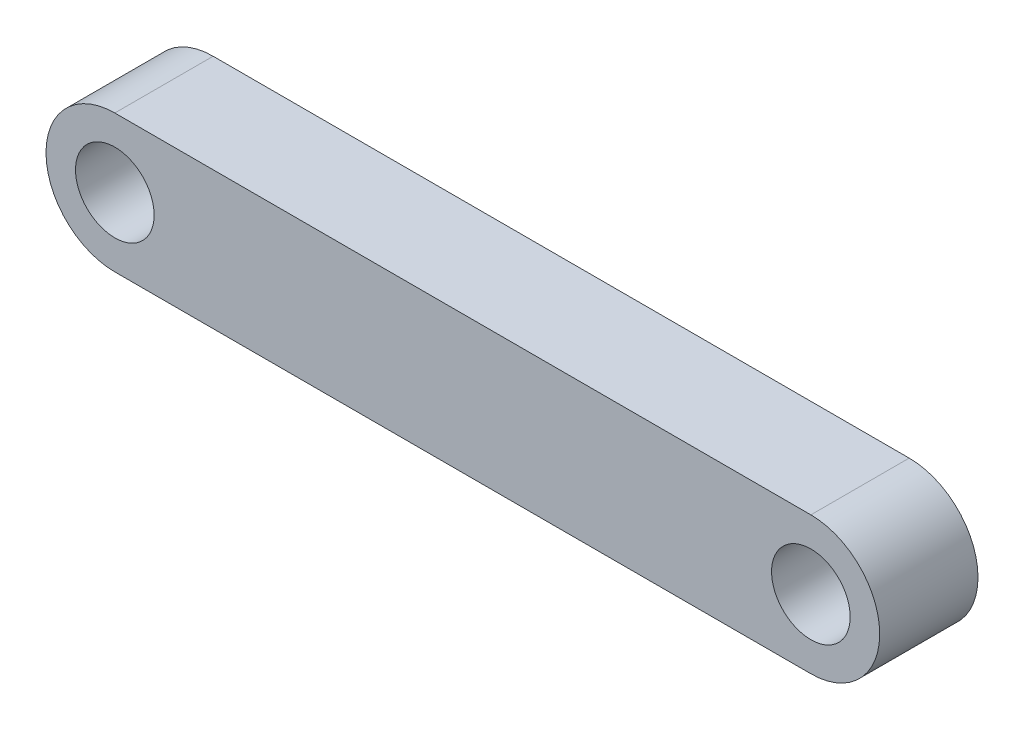
ISO-10303-21;
HEADER;
FILE_DESCRIPTION(('STEP AP214'),'2;1');
FILE_NAME('part.step','',(''),(''),'','','');
FILE_SCHEMA(('AUTOMOTIVE_DESIGN { 1 0 10303 214 1 1 1 1 }'));
ENDSEC;
DATA;
#1=APPLICATION_CONTEXT('core data for automotive mechanical design processes');
#2=APPLICATION_PROTOCOL_DEFINITION('international standard','automotive_design',2000,#1);
#3=PRODUCT_CONTEXT('',#1,'mechanical');
#4=PRODUCT('Part','Part','',(#3));
#5=PRODUCT_RELATED_PRODUCT_CATEGORY('part','',(#4));
#6=PRODUCT_DEFINITION_FORMATION('','',#4);
#7=PRODUCT_DEFINITION_CONTEXT('part definition',#1,'design');
#8=PRODUCT_DEFINITION('design','',#6,#7);
#9=PRODUCT_DEFINITION_SHAPE('','',#8);
#10=(LENGTH_UNIT() NAMED_UNIT(*) SI_UNIT(.MILLI.,.METRE.));
#11=(NAMED_UNIT(*) PLANE_ANGLE_UNIT() SI_UNIT($,.RADIAN.));
#12=(NAMED_UNIT(*) SI_UNIT($,.STERADIAN.) SOLID_ANGLE_UNIT());
#13=UNCERTAINTY_MEASURE_WITH_UNIT(LENGTH_MEASURE(1.E-05),#10,'distance_accuracy_value','');
#14=(GEOMETRIC_REPRESENTATION_CONTEXT(3) GLOBAL_UNCERTAINTY_ASSIGNED_CONTEXT((#13)) GLOBAL_UNIT_ASSIGNED_CONTEXT((#10,
#11,#12)) REPRESENTATION_CONTEXT('',''));
#15=CARTESIAN_POINT('',(0.,0.,0.));
#16=DIRECTION('',(0.,0.,1.));
#17=DIRECTION('',(1.,0.,0.));
#18=AXIS2_PLACEMENT_3D('',#15,#16,#17);
#19=CARTESIAN_POINT('',(0.,-35.,50.));
#20=DIRECTION('',(0.,-1.,0.));
#21=DIRECTION('',(1.,0.,0.));
#22=AXIS2_PLACEMENT_3D('',#19,#20,#21);
#23=PLANE('',#22);
#24=DIRECTION('',(-1.,0.,0.));
#25=VECTOR('',#24,1.);
#26=CARTESIAN_POINT('',(0.,-35.,0.));
#27=LINE('',#26,#25);
#28=CARTESIAN_POINT('',(354.,-35.,0.));
#29=VERTEX_POINT('',#28);
#30=CARTESIAN_POINT('',(0.,-35.,0.));
#31=VERTEX_POINT('',#30);
#32=EDGE_CURVE('E113',#29,#31,#27,.T.);
#33=ORIENTED_EDGE('',*,*,#32,.F.);
#34=DIRECTION('',(0.,0.,-1.));
#35=VECTOR('',#34,1.);
#36=CARTESIAN_POINT('',(354.,-35.,50.));
#37=LINE('',#36,#35);
#38=CARTESIAN_POINT('',(354.,-35.,50.));
#39=VERTEX_POINT('',#38);
#40=EDGE_CURVE('E11',#39,#29,#37,.T.);
#41=ORIENTED_EDGE('',*,*,#40,.F.);
#42=DIRECTION('',(-1.,0.,0.));
#43=VECTOR('',#42,1.);
#44=CARTESIAN_POINT('',(0.,-35.,50.));
#45=LINE('',#44,#43);
#46=CARTESIAN_POINT('',(0.,-35.,50.));
#47=VERTEX_POINT('',#46);
#48=EDGE_CURVE('E94',#39,#47,#45,.T.);
#49=ORIENTED_EDGE('',*,*,#48,.T.);
#50=DIRECTION('',(0.,0.,-1.));
#51=VECTOR('',#50,1.);
#52=CARTESIAN_POINT('',(0.,-35.,50.));
#53=LINE('',#52,#51);
#54=EDGE_CURVE('E85',#47,#31,#53,.T.);
#55=ORIENTED_EDGE('',*,*,#54,.T.);
#56=EDGE_LOOP('',(#33,#41,#49,#55));
#57=FACE_BOUND('',#56,.T.);
#58=ADVANCED_FACE('F44',(#57),#23,.T.);
#59=CARTESIAN_POINT('',(354.,0.,50.));
#60=DIRECTION('',(0.,0.,-1.));
#61=DIRECTION('',(-1.,0.,0.));
#62=AXIS2_PLACEMENT_3D('',#59,#60,#61);
#63=CYLINDRICAL_SURFACE('',#62,35.);
#64=CARTESIAN_POINT('',(354.,0.,0.));
#65=DIRECTION('',(0.,0.,1.));
#66=DIRECTION('',(1.,0.,0.));
#67=AXIS2_PLACEMENT_3D('',#64,#65,#66);
#68=CIRCLE('',#67,35.);
#69=CARTESIAN_POINT('',(354.,35.,0.));
#70=VERTEX_POINT('',#69);
#71=EDGE_CURVE('E99',#29,#70,#68,.T.);
#72=ORIENTED_EDGE('',*,*,#71,.T.);
#73=DIRECTION('',(0.,0.,-1.));
#74=VECTOR('',#73,1.);
#75=CARTESIAN_POINT('',(354.,35.,50.));
#76=LINE('',#75,#74);
#77=CARTESIAN_POINT('',(354.,35.,50.));
#78=VERTEX_POINT('',#77);
#79=EDGE_CURVE('E53',#78,#70,#76,.T.);
#80=ORIENTED_EDGE('',*,*,#79,.F.);
#81=CARTESIAN_POINT('',(354.,0.,50.));
#82=DIRECTION('',(0.,0.,1.));
#83=DIRECTION('',(1.,0.,0.));
#84=AXIS2_PLACEMENT_3D('',#81,#82,#83);
#85=CIRCLE('',#84,35.);
#86=EDGE_CURVE('E90',#39,#78,#85,.T.);
#87=ORIENTED_EDGE('',*,*,#86,.F.);
#88=ORIENTED_EDGE('',*,*,#40,.T.);
#89=EDGE_LOOP('',(#72,#80,#87,#88));
#90=FACE_BOUND('',#89,.T.);
#91=ADVANCED_FACE('F98',(#90),#63,.T.);
#92=CARTESIAN_POINT('',(0.,35.,50.));
#93=DIRECTION('',(0.,1.,0.));
#94=DIRECTION('',(-1.,0.,0.));
#95=AXIS2_PLACEMENT_3D('',#92,#93,#94);
#96=PLANE('',#95);
#97=DIRECTION('',(1.,0.,0.));
#98=VECTOR('',#97,1.);
#99=CARTESIAN_POINT('',(0.,35.,0.));
#100=LINE('',#99,#98);
#101=CARTESIAN_POINT('',(0.,35.,0.));
#102=VERTEX_POINT('',#101);
#103=EDGE_CURVE('E118',#102,#70,#100,.T.);
#104=ORIENTED_EDGE('',*,*,#103,.F.);
#105=DIRECTION('',(0.,0.,-1.));
#106=VECTOR('',#105,1.);
#107=CARTESIAN_POINT('',(0.,35.,50.));
#108=LINE('',#107,#106);
#109=CARTESIAN_POINT('',(0.,35.,50.));
#110=VERTEX_POINT('',#109);
#111=EDGE_CURVE('E77',#110,#102,#108,.T.);
#112=ORIENTED_EDGE('',*,*,#111,.F.);
#113=DIRECTION('',(1.,0.,0.));
#114=VECTOR('',#113,1.);
#115=CARTESIAN_POINT('',(0.,35.,50.));
#116=LINE('',#115,#114);
#117=EDGE_CURVE('E91',#110,#78,#116,.T.);
#118=ORIENTED_EDGE('',*,*,#117,.T.);
#119=ORIENTED_EDGE('',*,*,#79,.T.);
#120=EDGE_LOOP('',(#104,#112,#118,#119));
#121=FACE_BOUND('',#120,.T.);
#122=ADVANCED_FACE('F102',(#121),#96,.T.);
#123=CARTESIAN_POINT('',(0.,0.,50.));
#124=DIRECTION('',(0.,0.,-1.));
#125=DIRECTION('',(-1.,0.,0.));
#126=AXIS2_PLACEMENT_3D('',#123,#124,#125);
#127=CYLINDRICAL_SURFACE('',#126,20.);
#128=CARTESIAN_POINT('',(0.,0.,50.));
#129=DIRECTION('',(0.,0.,1.));
#130=DIRECTION('',(1.,0.,0.));
#131=AXIS2_PLACEMENT_3D('',#128,#129,#130);
#132=CIRCLE('',#131,20.);
#133=CARTESIAN_POINT('',(20.,0.,50.));
#134=VERTEX_POINT('',#133);
#135=EDGE_CURVE('E127',#134,#134,#132,.T.);
#136=ORIENTED_EDGE('',*,*,#135,.T.);
#137=EDGE_LOOP('',(#136));
#138=FACE_BOUND('',#137,.T.);
#139=CARTESIAN_POINT('',(0.,0.,0.));
#140=DIRECTION('',(0.,0.,1.));
#141=DIRECTION('',(1.,0.,0.));
#142=AXIS2_PLACEMENT_3D('',#139,#140,#141);
#143=CIRCLE('',#142,20.);
#144=CARTESIAN_POINT('',(20.,0.,0.));
#145=VERTEX_POINT('',#144);
#146=EDGE_CURVE('E115',#145,#145,#143,.T.);
#147=ORIENTED_EDGE('',*,*,#146,.F.);
#148=EDGE_LOOP('',(#147));
#149=FACE_BOUND('',#148,.T.);
#150=ADVANCED_FACE('F140',(#138,#149),#127,.F.);
#151=CARTESIAN_POINT('',(354.,0.,50.));
#152=DIRECTION('',(0.,0.,-1.));
#153=DIRECTION('',(-1.,0.,0.));
#154=AXIS2_PLACEMENT_3D('',#151,#152,#153);
#155=CYLINDRICAL_SURFACE('',#154,20.);
#156=CARTESIAN_POINT('',(354.,0.,50.));
#157=DIRECTION('',(0.,0.,1.));
#158=DIRECTION('',(1.,0.,0.));
#159=AXIS2_PLACEMENT_3D('',#156,#157,#158);
#160=CIRCLE('',#159,20.);
#161=CARTESIAN_POINT('',(374.,0.,50.));
#162=VERTEX_POINT('',#161);
#163=EDGE_CURVE('E122',#162,#162,#160,.T.);
#164=ORIENTED_EDGE('',*,*,#163,.T.);
#165=EDGE_LOOP('',(#164));
#166=FACE_BOUND('',#165,.T.);
#167=CARTESIAN_POINT('',(354.,0.,0.));
#168=DIRECTION('',(0.,0.,1.));
#169=DIRECTION('',(1.,0.,0.));
#170=AXIS2_PLACEMENT_3D('',#167,#168,#169);
#171=CIRCLE('',#170,20.);
#172=CARTESIAN_POINT('',(374.,0.,0.));
#173=VERTEX_POINT('',#172);
#174=EDGE_CURVE('E108',#173,#173,#171,.T.);
#175=ORIENTED_EDGE('',*,*,#174,.F.);
#176=EDGE_LOOP('',(#175));
#177=FACE_BOUND('',#176,.T.);
#178=ADVANCED_FACE('F50',(#166,#177),#155,.F.);
#179=CARTESIAN_POINT('',(0.,0.,50.));
#180=DIRECTION('',(0.,0.,-1.));
#181=DIRECTION('',(-1.,0.,0.));
#182=AXIS2_PLACEMENT_3D('',#179,#180,#181);
#183=CYLINDRICAL_SURFACE('',#182,35.);
#184=CARTESIAN_POINT('',(0.,0.,0.));
#185=DIRECTION('',(0.,0.,1.));
#186=DIRECTION('',(1.,0.,0.));
#187=AXIS2_PLACEMENT_3D('',#184,#185,#186);
#188=CIRCLE('',#187,35.);
#189=EDGE_CURVE('E123',#102,#31,#188,.T.);
#190=ORIENTED_EDGE('',*,*,#189,.T.);
#191=ORIENTED_EDGE('',*,*,#54,.F.);
#192=CARTESIAN_POINT('',(0.,0.,50.));
#193=DIRECTION('',(0.,0.,1.));
#194=DIRECTION('',(1.,0.,0.));
#195=AXIS2_PLACEMENT_3D('',#192,#193,#194);
#196=CIRCLE('',#195,35.);
#197=EDGE_CURVE('E62',#110,#47,#196,.T.);
#198=ORIENTED_EDGE('',*,*,#197,.F.);
#199=ORIENTED_EDGE('',*,*,#111,.T.);
#200=EDGE_LOOP('',(#190,#191,#198,#199));
#201=FACE_BOUND('',#200,.T.);
#202=ADVANCED_FACE('F148',(#201),#183,.T.);
#203=CARTESIAN_POINT('',(0.,0.,50.));
#204=DIRECTION('',(0.,0.,1.));
#205=DIRECTION('',(1.,0.,0.));
#206=AXIS2_PLACEMENT_3D('',#203,#204,#205);
#207=PLANE('',#206);
#208=ORIENTED_EDGE('',*,*,#163,.F.);
#209=EDGE_LOOP('',(#208));
#210=FACE_BOUND('',#209,.T.);
#211=ORIENTED_EDGE('',*,*,#135,.F.);
#212=EDGE_LOOP('',(#211));
#213=FACE_BOUND('',#212,.T.);
#214=ORIENTED_EDGE('',*,*,#48,.F.);
#215=ORIENTED_EDGE('',*,*,#86,.T.);
#216=ORIENTED_EDGE('',*,*,#117,.F.);
#217=ORIENTED_EDGE('',*,*,#197,.T.);
#218=EDGE_LOOP('',(#214,#215,#216,#217));
#219=FACE_BOUND('',#218,.T.);
#220=ADVANCED_FACE('F93',(#210,#213,#219),#207,.T.);
#221=CARTESIAN_POINT('',(0.,0.,0.));
#222=DIRECTION('',(0.,0.,1.));
#223=DIRECTION('',(1.,0.,0.));
#224=AXIS2_PLACEMENT_3D('',#221,#222,#223);
#225=PLANE('',#224);
#226=ORIENTED_EDGE('',*,*,#174,.T.);
#227=EDGE_LOOP('',(#226));
#228=FACE_BOUND('',#227,.T.);
#229=ORIENTED_EDGE('',*,*,#146,.T.);
#230=EDGE_LOOP('',(#229));
#231=FACE_BOUND('',#230,.T.);
#232=ORIENTED_EDGE('',*,*,#32,.T.);
#233=ORIENTED_EDGE('',*,*,#189,.F.);
#234=ORIENTED_EDGE('',*,*,#103,.T.);
#235=ORIENTED_EDGE('',*,*,#71,.F.);
#236=EDGE_LOOP('',(#232,#233,#234,#235));
#237=FACE_BOUND('',#236,.T.);
#238=ADVANCED_FACE('F151',(#228,#231,#237),#225,.F.);
#239=CLOSED_SHELL('',(#58,#91,#122,#150,#178,#202,#220,#238));
#240=MANIFOLD_SOLID_BREP('B2',#239);
#241=ADVANCED_BREP_SHAPE_REPRESENTATION('',(#18,#240),#14);
#242=SHAPE_DEFINITION_REPRESENTATION(#9,#241);
ENDSEC;
END-ISO-10303-21;
